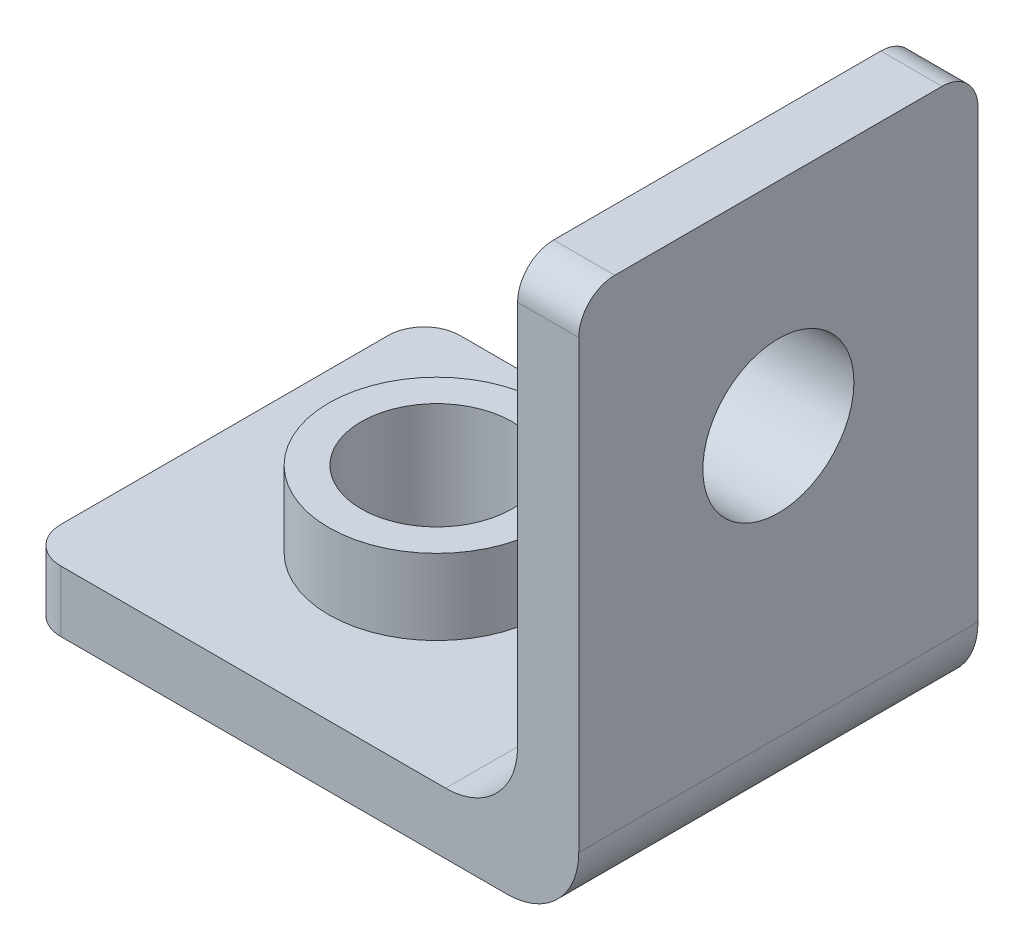
ISO-10303-21;
HEADER;
FILE_DESCRIPTION(('STEP AP214'),'2;1');
FILE_NAME('part.step','',(''),(''),'','','');
FILE_SCHEMA(('AUTOMOTIVE_DESIGN { 1 0 10303 214 1 1 1 1 }'));
ENDSEC;
DATA;
#1=APPLICATION_CONTEXT('core data for automotive mechanical design processes');
#2=APPLICATION_PROTOCOL_DEFINITION('international standard','automotive_design',2000,#1);
#3=PRODUCT_CONTEXT('',#1,'mechanical');
#4=PRODUCT('Part','Part','',(#3));
#5=PRODUCT_RELATED_PRODUCT_CATEGORY('part','',(#4));
#6=PRODUCT_DEFINITION_FORMATION('','',#4);
#7=PRODUCT_DEFINITION_CONTEXT('part definition',#1,'design');
#8=PRODUCT_DEFINITION('design','',#6,#7);
#9=PRODUCT_DEFINITION_SHAPE('','',#8);
#10=(LENGTH_UNIT() NAMED_UNIT(*) SI_UNIT(.MILLI.,.METRE.));
#11=(NAMED_UNIT(*) PLANE_ANGLE_UNIT() SI_UNIT($,.RADIAN.));
#12=(NAMED_UNIT(*) SI_UNIT($,.STERADIAN.) SOLID_ANGLE_UNIT());
#13=UNCERTAINTY_MEASURE_WITH_UNIT(LENGTH_MEASURE(1.E-05),#10,'distance_accuracy_value','');
#14=(GEOMETRIC_REPRESENTATION_CONTEXT(3) GLOBAL_UNCERTAINTY_ASSIGNED_CONTEXT((#13)) GLOBAL_UNIT_ASSIGNED_CONTEXT((#10,
#11,#12)) REPRESENTATION_CONTEXT('',''));
#15=CARTESIAN_POINT('',(0.,0.,0.));
#16=DIRECTION('',(0.,0.,1.));
#17=DIRECTION('',(1.,0.,0.));
#18=AXIS2_PLACEMENT_3D('',#15,#16,#17);
#19=CARTESIAN_POINT('',(-15.4,0.,11.1));
#20=DIRECTION('',(0.,1.,0.));
#21=DIRECTION('',(0.,0.,1.));
#22=AXIS2_PLACEMENT_3D('',#19,#20,#21);
#23=PLANE('',#22);
#24=CARTESIAN_POINT('',(-9.5,0.,5.55));
#25=DIRECTION('',(0.,-1.,0.));
#26=DIRECTION('',(0.,0.,-1.));
#27=AXIS2_PLACEMENT_3D('',#24,#25,#26);
#28=CIRCLE('',#27,2.09999999999999);
#29=CARTESIAN_POINT('',(-9.5,0.,3.45000000000001));
#30=VERTEX_POINT('',#29);
#31=EDGE_CURVE('E508',#30,#30,#28,.T.);
#32=ORIENTED_EDGE('',*,*,#31,.F.);
#33=EDGE_LOOP('',(#32));
#34=FACE_BOUND('',#33,.T.);
#35=DIRECTION('',(1.,0.,0.));
#36=VECTOR('',#35,1.);
#37=CARTESIAN_POINT('',(-15.4,0.,0.));
#38=LINE('',#37,#36);
#39=CARTESIAN_POINT('',(-14.4,0.,0.));
#40=VERTEX_POINT('',#39);
#41=CARTESIAN_POINT('',(-2.,0.,0.));
#42=VERTEX_POINT('',#41);
#43=EDGE_CURVE('E165',#40,#42,#38,.T.);
#44=ORIENTED_EDGE('',*,*,#43,.T.);
#45=DIRECTION('',(0.,0.,-1.));
#46=VECTOR('',#45,1.);
#47=CARTESIAN_POINT('',(-2.,0.,11.1));
#48=LINE('',#47,#46);
#49=CARTESIAN_POINT('',(-2.,0.,11.1));
#50=VERTEX_POINT('',#49);
#51=EDGE_CURVE('E55',#42,#50,#48,.F.);
#52=ORIENTED_EDGE('',*,*,#51,.T.);
#53=DIRECTION('',(1.,0.,0.));
#54=VECTOR('',#53,1.);
#55=CARTESIAN_POINT('',(-15.4,0.,11.1));
#56=LINE('',#55,#54);
#57=CARTESIAN_POINT('',(-14.4,0.,11.1));
#58=VERTEX_POINT('',#57);
#59=EDGE_CURVE('E143',#58,#50,#56,.T.);
#60=ORIENTED_EDGE('',*,*,#59,.F.);
#61=CARTESIAN_POINT('',(-14.4,0.,10.1));
#62=DIRECTION('',(0.,1.,0.));
#63=DIRECTION('',(0.,0.,1.));
#64=AXIS2_PLACEMENT_3D('',#61,#62,#63);
#65=CIRCLE('',#64,1.);
#66=CARTESIAN_POINT('',(-15.4,0.,10.1));
#67=VERTEX_POINT('',#66);
#68=EDGE_CURVE('E130',#58,#67,#65,.F.);
#69=ORIENTED_EDGE('',*,*,#68,.T.);
#70=DIRECTION('',(0.,0.,-1.));
#71=VECTOR('',#70,1.);
#72=CARTESIAN_POINT('',(-15.4,0.,11.1));
#73=LINE('',#72,#71);
#74=CARTESIAN_POINT('',(-15.4,0.,0.999999999999999));
#75=VERTEX_POINT('',#74);
#76=EDGE_CURVE('E164',#67,#75,#73,.T.);
#77=ORIENTED_EDGE('',*,*,#76,.T.);
#78=CARTESIAN_POINT('',(-14.4,0.,0.999999999999999));
#79=DIRECTION('',(0.,1.,0.));
#80=DIRECTION('',(0.,0.,1.));
#81=AXIS2_PLACEMENT_3D('',#78,#79,#80);
#82=CIRCLE('',#81,1.);
#83=EDGE_CURVE('E139',#75,#40,#82,.F.);
#84=ORIENTED_EDGE('',*,*,#83,.T.);
#85=EDGE_LOOP('',(#44,#52,#60,#69,#77,#84));
#86=FACE_BOUND('',#85,.T.);
#87=ADVANCED_FACE('F40',(#34,#86),#23,.F.);
#88=CARTESIAN_POINT('',(0.,0.,11.1));
#89=DIRECTION('',(-1.,0.,0.));
#90=DIRECTION('',(0.,0.,1.));
#91=AXIS2_PLACEMENT_3D('',#88,#89,#90);
#92=PLANE('',#91);
#93=CARTESIAN_POINT('',(0.,9.5,5.55));
#94=DIRECTION('',(1.,0.,0.));
#95=DIRECTION('',(0.,0.,-1.));
#96=AXIS2_PLACEMENT_3D('',#93,#94,#95);
#97=CIRCLE('',#96,2.09999999999999);
#98=CARTESIAN_POINT('',(0.,9.5,3.45000000000001));
#99=VERTEX_POINT('',#98);
#100=EDGE_CURVE('E500',#99,#99,#97,.T.);
#101=ORIENTED_EDGE('',*,*,#100,.F.);
#102=EDGE_LOOP('',(#101));
#103=FACE_BOUND('',#102,.T.);
#104=DIRECTION('',(0.,1.,0.));
#105=VECTOR('',#104,1.);
#106=CARTESIAN_POINT('',(0.,0.,11.1));
#107=LINE('',#106,#105);
#108=CARTESIAN_POINT('',(0.,2.,11.1));
#109=VERTEX_POINT('',#108);
#110=CARTESIAN_POINT('',(0.,14.4,11.1));
#111=VERTEX_POINT('',#110);
#112=EDGE_CURVE('E150',#109,#111,#107,.T.);
#113=ORIENTED_EDGE('',*,*,#112,.F.);
#114=DIRECTION('',(0.,0.,-1.));
#115=VECTOR('',#114,1.);
#116=CARTESIAN_POINT('',(0.,2.,11.1));
#117=LINE('',#116,#115);
#118=CARTESIAN_POINT('',(0.,2.,0.));
#119=VERTEX_POINT('',#118);
#120=EDGE_CURVE('E223',#109,#119,#117,.T.);
#121=ORIENTED_EDGE('',*,*,#120,.T.);
#122=DIRECTION('',(0.,1.,0.));
#123=VECTOR('',#122,1.);
#124=CARTESIAN_POINT('',(0.,0.,0.));
#125=LINE('',#124,#123);
#126=CARTESIAN_POINT('',(0.,14.4,0.));
#127=VERTEX_POINT('',#126);
#128=EDGE_CURVE('E167',#119,#127,#125,.T.);
#129=ORIENTED_EDGE('',*,*,#128,.T.);
#130=CARTESIAN_POINT('',(0.,14.4,0.999999999999999));
#131=DIRECTION('',(-1.,0.,0.));
#132=DIRECTION('',(0.,0.,1.));
#133=AXIS2_PLACEMENT_3D('',#130,#131,#132);
#134=CIRCLE('',#133,1.);
#135=CARTESIAN_POINT('',(0.,15.4,0.999999999999999));
#136=VERTEX_POINT('',#135);
#137=EDGE_CURVE('E209',#127,#136,#134,.F.);
#138=ORIENTED_EDGE('',*,*,#137,.T.);
#139=DIRECTION('',(0.,0.,-1.));
#140=VECTOR('',#139,1.);
#141=CARTESIAN_POINT('',(0.,15.4,11.1));
#142=LINE('',#141,#140);
#143=CARTESIAN_POINT('',(0.,15.4,10.1));
#144=VERTEX_POINT('',#143);
#145=EDGE_CURVE('E178',#144,#136,#142,.T.);
#146=ORIENTED_EDGE('',*,*,#145,.F.);
#147=CARTESIAN_POINT('',(0.,14.4,10.1));
#148=DIRECTION('',(-1.,0.,0.));
#149=DIRECTION('',(0.,0.,1.));
#150=AXIS2_PLACEMENT_3D('',#147,#148,#149);
#151=CIRCLE('',#150,1.);
#152=EDGE_CURVE('E206',#144,#111,#151,.F.);
#153=ORIENTED_EDGE('',*,*,#152,.T.);
#154=EDGE_LOOP('',(#113,#121,#129,#138,#146,#153));
#155=FACE_BOUND('',#154,.T.);
#156=ADVANCED_FACE('F255',(#103,#155),#92,.F.);
#157=CARTESIAN_POINT('',(0.,15.4,11.1));
#158=DIRECTION('',(0.,-1.,0.));
#159=DIRECTION('',(0.,0.,-1.));
#160=AXIS2_PLACEMENT_3D('',#157,#158,#159);
#161=PLANE('',#160);
#162=ORIENTED_EDGE('',*,*,#145,.T.);
#163=DIRECTION('',(-1.,0.,0.));
#164=VECTOR('',#163,1.);
#165=CARTESIAN_POINT('',(0.,15.4,0.999999999999999));
#166=LINE('',#165,#164);
#167=CARTESIAN_POINT('',(-1.7,15.4,0.999999999999999));
#168=VERTEX_POINT('',#167);
#169=EDGE_CURVE('E199',#136,#168,#166,.T.);
#170=ORIENTED_EDGE('',*,*,#169,.T.);
#171=DIRECTION('',(0.,0.,-1.));
#172=VECTOR('',#171,1.);
#173=CARTESIAN_POINT('',(-1.7,15.4,11.1));
#174=LINE('',#173,#172);
#175=CARTESIAN_POINT('',(-1.7,15.4,10.1));
#176=VERTEX_POINT('',#175);
#177=EDGE_CURVE('E175',#176,#168,#174,.T.);
#178=ORIENTED_EDGE('',*,*,#177,.F.);
#179=DIRECTION('',(-1.,0.,0.));
#180=VECTOR('',#179,1.);
#181=CARTESIAN_POINT('',(0.,15.4,10.1));
#182=LINE('',#181,#180);
#183=EDGE_CURVE('E197',#176,#144,#182,.F.);
#184=ORIENTED_EDGE('',*,*,#183,.T.);
#185=EDGE_LOOP('',(#162,#170,#178,#184));
#186=FACE_BOUND('',#185,.T.);
#187=ADVANCED_FACE('F264',(#186),#161,.F.);
#188=CARTESIAN_POINT('',(-1.7,15.4,11.1));
#189=DIRECTION('',(1.,0.,0.));
#190=DIRECTION('',(0.,1.,0.));
#191=AXIS2_PLACEMENT_3D('',#188,#189,#190);
#192=PLANE('',#191);
#193=CARTESIAN_POINT('',(-1.7,9.5,5.55));
#194=DIRECTION('',(1.,0.,0.));
#195=DIRECTION('',(0.,1.,0.));
#196=AXIS2_PLACEMENT_3D('',#193,#194,#195);
#197=CIRCLE('',#196,3.);
#198=CARTESIAN_POINT('',(-1.7,9.5,2.55));
#199=VERTEX_POINT('',#198);
#200=EDGE_CURVE('E215',#199,#199,#197,.T.);
#201=ORIENTED_EDGE('',*,*,#200,.T.);
#202=EDGE_LOOP('',(#201));
#203=FACE_BOUND('',#202,.T.);
#204=DIRECTION('',(0.,-1.,0.));
#205=VECTOR('',#204,1.);
#206=CARTESIAN_POINT('',(-1.7,15.4,0.));
#207=LINE('',#206,#205);
#208=CARTESIAN_POINT('',(-1.7,14.4,0.));
#209=VERTEX_POINT('',#208);
#210=CARTESIAN_POINT('',(-1.7,3.7,0.));
#211=VERTEX_POINT('',#210);
#212=EDGE_CURVE('E155',#209,#211,#207,.T.);
#213=ORIENTED_EDGE('',*,*,#212,.T.);
#214=DIRECTION('',(0.,0.,-1.));
#215=VECTOR('',#214,1.);
#216=CARTESIAN_POINT('',(-1.7,3.7,11.1));
#217=LINE('',#216,#215);
#218=CARTESIAN_POINT('',(-1.7,3.7,11.1));
#219=VERTEX_POINT('',#218);
#220=EDGE_CURVE('E221',#211,#219,#217,.F.);
#221=ORIENTED_EDGE('',*,*,#220,.T.);
#222=DIRECTION('',(0.,-1.,0.));
#223=VECTOR('',#222,1.);
#224=CARTESIAN_POINT('',(-1.7,15.4,11.1));
#225=LINE('',#224,#223);
#226=CARTESIAN_POINT('',(-1.7,14.4,11.1));
#227=VERTEX_POINT('',#226);
#228=EDGE_CURVE('E153',#227,#219,#225,.T.);
#229=ORIENTED_EDGE('',*,*,#228,.F.);
#230=CARTESIAN_POINT('',(-1.7,14.4,10.1));
#231=DIRECTION('',(1.,0.,0.));
#232=DIRECTION('',(0.,1.,0.));
#233=AXIS2_PLACEMENT_3D('',#230,#231,#232);
#234=CIRCLE('',#233,1.);
#235=EDGE_CURVE('E202',#227,#176,#234,.F.);
#236=ORIENTED_EDGE('',*,*,#235,.T.);
#237=ORIENTED_EDGE('',*,*,#177,.T.);
#238=CARTESIAN_POINT('',(-1.7,14.4,0.999999999999999));
#239=DIRECTION('',(1.,0.,0.));
#240=DIRECTION('',(0.,1.,0.));
#241=AXIS2_PLACEMENT_3D('',#238,#239,#240);
#242=CIRCLE('',#241,1.);
#243=EDGE_CURVE('E204',#168,#209,#242,.F.);
#244=ORIENTED_EDGE('',*,*,#243,.T.);
#245=EDGE_LOOP('',(#213,#221,#229,#236,#237,#244));
#246=FACE_BOUND('',#245,.T.);
#247=ADVANCED_FACE('F237',(#203,#246),#192,.F.);
#248=CARTESIAN_POINT('',(-1.69999999999999,1.7,11.1));
#249=DIRECTION('',(0.,-1.,0.));
#250=DIRECTION('',(0.,0.,-1.));
#251=AXIS2_PLACEMENT_3D('',#248,#249,#250);
#252=PLANE('',#251);
#253=CARTESIAN_POINT('',(-9.5,1.7,5.55));
#254=DIRECTION('',(0.,-1.,0.));
#255=DIRECTION('',(0.,0.,-1.));
#256=AXIS2_PLACEMENT_3D('',#253,#254,#255);
#257=CIRCLE('',#256,3.);
#258=CARTESIAN_POINT('',(-9.5,1.7,2.55));
#259=VERTEX_POINT('',#258);
#260=EDGE_CURVE('E211',#259,#259,#257,.F.);
#261=ORIENTED_EDGE('',*,*,#260,.F.);
#262=EDGE_LOOP('',(#261));
#263=FACE_BOUND('',#262,.T.);
#264=DIRECTION('',(-1.,0.,0.));
#265=VECTOR('',#264,1.);
#266=CARTESIAN_POINT('',(-1.69999999999999,1.7,11.1));
#267=LINE('',#266,#265);
#268=CARTESIAN_POINT('',(-3.7,1.7,11.1));
#269=VERTEX_POINT('',#268);
#270=CARTESIAN_POINT('',(-14.4,1.7,11.1));
#271=VERTEX_POINT('',#270);
#272=EDGE_CURVE('E146',#269,#271,#267,.T.);
#273=ORIENTED_EDGE('',*,*,#272,.F.);
#274=DIRECTION('',(0.,0.,-1.));
#275=VECTOR('',#274,1.);
#276=CARTESIAN_POINT('',(-3.7,1.7,0.));
#277=LINE('',#276,#275);
#278=CARTESIAN_POINT('',(-3.7,1.7,0.));
#279=VERTEX_POINT('',#278);
#280=EDGE_CURVE('E214',#269,#279,#277,.T.);
#281=ORIENTED_EDGE('',*,*,#280,.T.);
#282=DIRECTION('',(-1.,0.,0.));
#283=VECTOR('',#282,1.);
#284=CARTESIAN_POINT('',(-1.69999999999999,1.7,0.));
#285=LINE('',#284,#283);
#286=CARTESIAN_POINT('',(-14.4,1.7,0.));
#287=VERTEX_POINT('',#286);
#288=EDGE_CURVE('E151',#279,#287,#285,.T.);
#289=ORIENTED_EDGE('',*,*,#288,.T.);
#290=CARTESIAN_POINT('',(-14.4,1.7,0.999999999999999));
#291=DIRECTION('',(0.,-1.,0.));
#292=DIRECTION('',(0.,0.,-1.));
#293=AXIS2_PLACEMENT_3D('',#290,#291,#292);
#294=CIRCLE('',#293,1.);
#295=CARTESIAN_POINT('',(-15.4,1.7,0.999999999999999));
#296=VERTEX_POINT('',#295);
#297=EDGE_CURVE('E187',#287,#296,#294,.F.);
#298=ORIENTED_EDGE('',*,*,#297,.T.);
#299=DIRECTION('',(0.,0.,-1.));
#300=VECTOR('',#299,1.);
#301=CARTESIAN_POINT('',(-15.4,1.7,11.1));
#302=LINE('',#301,#300);
#303=CARTESIAN_POINT('',(-15.4,1.7,10.1));
#304=VERTEX_POINT('',#303);
#305=EDGE_CURVE('E172',#304,#296,#302,.T.);
#306=ORIENTED_EDGE('',*,*,#305,.F.);
#307=CARTESIAN_POINT('',(-14.4,1.7,10.1));
#308=DIRECTION('',(0.,-1.,0.));
#309=DIRECTION('',(0.,0.,-1.));
#310=AXIS2_PLACEMENT_3D('',#307,#308,#309);
#311=CIRCLE('',#310,1.);
#312=EDGE_CURVE('E189',#304,#271,#311,.F.);
#313=ORIENTED_EDGE('',*,*,#312,.T.);
#314=EDGE_LOOP('',(#273,#281,#289,#298,#306,#313));
#315=FACE_BOUND('',#314,.T.);
#316=ADVANCED_FACE('F242',(#263,#315),#252,.F.);
#317=CARTESIAN_POINT('',(-15.4,1.7,11.1));
#318=DIRECTION('',(1.,0.,0.));
#319=DIRECTION('',(0.,0.,-1.));
#320=AXIS2_PLACEMENT_3D('',#317,#318,#319);
#321=PLANE('',#320);
#322=ORIENTED_EDGE('',*,*,#76,.F.);
#323=DIRECTION('',(0.,-1.,0.));
#324=VECTOR('',#323,1.);
#325=CARTESIAN_POINT('',(-15.4,1.7,10.1));
#326=LINE('',#325,#324);
#327=EDGE_CURVE('E135',#67,#304,#326,.F.);
#328=ORIENTED_EDGE('',*,*,#327,.T.);
#329=ORIENTED_EDGE('',*,*,#305,.T.);
#330=DIRECTION('',(0.,-1.,0.));
#331=VECTOR('',#330,1.);
#332=CARTESIAN_POINT('',(-15.4,1.7,0.999999999999999));
#333=LINE('',#332,#331);
#334=EDGE_CURVE('E138',#296,#75,#333,.T.);
#335=ORIENTED_EDGE('',*,*,#334,.T.);
#336=EDGE_LOOP('',(#322,#328,#329,#335));
#337=FACE_BOUND('',#336,.T.);
#338=ADVANCED_FACE('F247',(#337),#321,.F.);
#339=CARTESIAN_POINT('',(0.,0.,11.1));
#340=DIRECTION('',(0.,0.,1.));
#341=DIRECTION('',(1.,0.,0.));
#342=AXIS2_PLACEMENT_3D('',#339,#340,#341);
#343=PLANE('',#342);
#344=ORIENTED_EDGE('',*,*,#59,.T.);
#345=CARTESIAN_POINT('',(-2.,2.,11.1));
#346=DIRECTION('',(0.,0.,1.));
#347=DIRECTION('',(1.,0.,0.));
#348=AXIS2_PLACEMENT_3D('',#345,#346,#347);
#349=CIRCLE('',#348,2.);
#350=EDGE_CURVE('E228',#50,#109,#349,.T.);
#351=ORIENTED_EDGE('',*,*,#350,.T.);
#352=ORIENTED_EDGE('',*,*,#112,.T.);
#353=DIRECTION('',(-1.,0.,0.));
#354=VECTOR('',#353,1.);
#355=CARTESIAN_POINT('',(-1.7,14.4,11.1));
#356=LINE('',#355,#354);
#357=EDGE_CURVE('E148',#111,#227,#356,.T.);
#358=ORIENTED_EDGE('',*,*,#357,.T.);
#359=ORIENTED_EDGE('',*,*,#228,.T.);
#360=CARTESIAN_POINT('',(-3.7,3.7,11.1));
#361=DIRECTION('',(0.,0.,1.));
#362=DIRECTION('',(1.,0.,0.));
#363=AXIS2_PLACEMENT_3D('',#360,#361,#362);
#364=CIRCLE('',#363,2.);
#365=EDGE_CURVE('E11',#219,#269,#364,.F.);
#366=ORIENTED_EDGE('',*,*,#365,.T.);
#367=ORIENTED_EDGE('',*,*,#272,.T.);
#368=DIRECTION('',(0.,-1.,0.));
#369=VECTOR('',#368,1.);
#370=CARTESIAN_POINT('',(-14.4,0.,11.1));
#371=LINE('',#370,#369);
#372=EDGE_CURVE('E134',#271,#58,#371,.T.);
#373=ORIENTED_EDGE('',*,*,#372,.T.);
#374=EDGE_LOOP('',(#344,#351,#352,#358,#359,#366,#367,#373));
#375=FACE_BOUND('',#374,.T.);
#376=ADVANCED_FACE('F142',(#375),#343,.T.);
#377=CARTESIAN_POINT('',(0.,0.,0.));
#378=DIRECTION('',(0.,0.,1.));
#379=DIRECTION('',(1.,0.,0.));
#380=AXIS2_PLACEMENT_3D('',#377,#378,#379);
#381=PLANE('',#380);
#382=ORIENTED_EDGE('',*,*,#128,.F.);
#383=CARTESIAN_POINT('',(-2.,2.,0.));
#384=DIRECTION('',(0.,0.,1.));
#385=DIRECTION('',(1.,0.,0.));
#386=AXIS2_PLACEMENT_3D('',#383,#384,#385);
#387=CIRCLE('',#386,2.);
#388=EDGE_CURVE('E63',#119,#42,#387,.F.);
#389=ORIENTED_EDGE('',*,*,#388,.T.);
#390=ORIENTED_EDGE('',*,*,#43,.F.);
#391=DIRECTION('',(0.,-1.,0.));
#392=VECTOR('',#391,1.);
#393=CARTESIAN_POINT('',(-14.4,0.,0.));
#394=LINE('',#393,#392);
#395=EDGE_CURVE('E194',#40,#287,#394,.F.);
#396=ORIENTED_EDGE('',*,*,#395,.T.);
#397=ORIENTED_EDGE('',*,*,#288,.F.);
#398=CARTESIAN_POINT('',(-3.7,3.7,0.));
#399=DIRECTION('',(0.,0.,1.));
#400=DIRECTION('',(1.,0.,0.));
#401=AXIS2_PLACEMENT_3D('',#398,#399,#400);
#402=CIRCLE('',#401,2.);
#403=EDGE_CURVE('E48',#279,#211,#402,.T.);
#404=ORIENTED_EDGE('',*,*,#403,.T.);
#405=ORIENTED_EDGE('',*,*,#212,.F.);
#406=DIRECTION('',(-1.,0.,0.));
#407=VECTOR('',#406,1.);
#408=CARTESIAN_POINT('',(0.,14.4,0.));
#409=LINE('',#408,#407);
#410=EDGE_CURVE('E191',#209,#127,#409,.F.);
#411=ORIENTED_EDGE('',*,*,#410,.T.);
#412=EDGE_LOOP('',(#382,#389,#390,#396,#397,#404,#405,#411));
#413=FACE_BOUND('',#412,.T.);
#414=ADVANCED_FACE('F231',(#413),#381,.F.);
#415=CARTESIAN_POINT('',(-14.4,0.,10.1));
#416=DIRECTION('',(0.,1.,0.));
#417=DIRECTION('',(0.,0.,1.));
#418=AXIS2_PLACEMENT_3D('',#415,#416,#417);
#419=CYLINDRICAL_SURFACE('',#418,1.);
#420=ORIENTED_EDGE('',*,*,#312,.F.);
#421=ORIENTED_EDGE('',*,*,#327,.F.);
#422=ORIENTED_EDGE('',*,*,#68,.F.);
#423=ORIENTED_EDGE('',*,*,#372,.F.);
#424=EDGE_LOOP('',(#420,#421,#422,#423));
#425=FACE_BOUND('',#424,.T.);
#426=ADVANCED_FACE('F133',(#425),#419,.T.);
#427=CARTESIAN_POINT('',(-14.4,1.7,0.999999999999999));
#428=DIRECTION('',(0.,-1.,0.));
#429=DIRECTION('',(0.,0.,-1.));
#430=AXIS2_PLACEMENT_3D('',#427,#428,#429);
#431=CYLINDRICAL_SURFACE('',#430,1.);
#432=ORIENTED_EDGE('',*,*,#297,.F.);
#433=ORIENTED_EDGE('',*,*,#395,.F.);
#434=ORIENTED_EDGE('',*,*,#83,.F.);
#435=ORIENTED_EDGE('',*,*,#334,.F.);
#436=EDGE_LOOP('',(#432,#433,#434,#435));
#437=FACE_BOUND('',#436,.T.);
#438=ADVANCED_FACE('F249',(#437),#431,.T.);
#439=CARTESIAN_POINT('',(0.,14.4,0.999999999999999));
#440=DIRECTION('',(-1.,0.,0.));
#441=DIRECTION('',(0.,0.,1.));
#442=AXIS2_PLACEMENT_3D('',#439,#440,#441);
#443=CYLINDRICAL_SURFACE('',#442,1.);
#444=ORIENTED_EDGE('',*,*,#137,.F.);
#445=ORIENTED_EDGE('',*,*,#410,.F.);
#446=ORIENTED_EDGE('',*,*,#243,.F.);
#447=ORIENTED_EDGE('',*,*,#169,.F.);
#448=EDGE_LOOP('',(#444,#445,#446,#447));
#449=FACE_BOUND('',#448,.T.);
#450=ADVANCED_FACE('F268',(#449),#443,.T.);
#451=CARTESIAN_POINT('',(0.,14.4,10.1));
#452=DIRECTION('',(1.,0.,0.));
#453=DIRECTION('',(0.,0.,-1.));
#454=AXIS2_PLACEMENT_3D('',#451,#452,#453);
#455=CYLINDRICAL_SURFACE('',#454,1.);
#456=ORIENTED_EDGE('',*,*,#152,.F.);
#457=ORIENTED_EDGE('',*,*,#183,.F.);
#458=ORIENTED_EDGE('',*,*,#235,.F.);
#459=ORIENTED_EDGE('',*,*,#357,.F.);
#460=EDGE_LOOP('',(#456,#457,#458,#459));
#461=FACE_BOUND('',#460,.T.);
#462=ADVANCED_FACE('F261',(#461),#455,.T.);
#463=CARTESIAN_POINT('',(-9.5,3.8,5.55));
#464=DIRECTION('',(0.,-1.,0.));
#465=DIRECTION('',(0.,0.,-1.));
#466=AXIS2_PLACEMENT_3D('',#463,#464,#465);
#467=CYLINDRICAL_SURFACE('',#466,3.);
#468=CARTESIAN_POINT('',(-9.5,3.8,5.55));
#469=DIRECTION('',(0.,1.,0.));
#470=DIRECTION('',(0.,0.,1.));
#471=AXIS2_PLACEMENT_3D('',#468,#469,#470);
#472=CIRCLE('',#471,3.);
#473=CARTESIAN_POINT('',(-9.5,3.8,2.55));
#474=VERTEX_POINT('',#473);
#475=EDGE_CURVE('E158',#474,#474,#472,.T.);
#476=CARTESIAN_POINT('',(-9.5,3.8,2.55));
#477=CARTESIAN_POINT('',(-9.5,3.778125,2.55));
#478=CARTESIAN_POINT('',(-9.5,3.75625,2.55));
#479=CARTESIAN_POINT('',(-9.5,3.7125,2.55));
#480=CARTESIAN_POINT('',(-9.5,3.690625,2.55));
#481=CARTESIAN_POINT('',(-9.5,3.646875,2.55));
#482=CARTESIAN_POINT('',(-9.5,3.625,2.55));
#483=CARTESIAN_POINT('',(-9.5,3.58125,2.55));
#484=CARTESIAN_POINT('',(-9.5,3.559375,2.55));
#485=CARTESIAN_POINT('',(-9.5,3.515625,2.55));
#486=CARTESIAN_POINT('',(-9.5,3.49375,2.55));
#487=CARTESIAN_POINT('',(-9.5,3.45,2.55));
#488=CARTESIAN_POINT('',(-9.5,3.428125,2.55));
#489=CARTESIAN_POINT('',(-9.5,3.384375,2.55));
#490=CARTESIAN_POINT('',(-9.5,3.3625,2.55));
#491=CARTESIAN_POINT('',(-9.5,3.31875,2.55));
#492=CARTESIAN_POINT('',(-9.5,3.296875,2.55));
#493=CARTESIAN_POINT('',(-9.5,3.253125,2.55));
#494=CARTESIAN_POINT('',(-9.5,3.23125,2.55));
#495=CARTESIAN_POINT('',(-9.5,3.1875,2.55));
#496=CARTESIAN_POINT('',(-9.5,3.165625,2.55));
#497=CARTESIAN_POINT('',(-9.5,3.121875,2.55));
#498=CARTESIAN_POINT('',(-9.5,3.1,2.55));
#499=CARTESIAN_POINT('',(-9.5,3.05625,2.55));
#500=CARTESIAN_POINT('',(-9.5,3.034375,2.55));
#501=CARTESIAN_POINT('',(-9.5,2.990625,2.55));
#502=CARTESIAN_POINT('',(-9.5,2.96875,2.55));
#503=CARTESIAN_POINT('',(-9.5,2.925,2.55));
#504=CARTESIAN_POINT('',(-9.5,2.903125,2.55));
#505=CARTESIAN_POINT('',(-9.5,2.859375,2.55));
#506=CARTESIAN_POINT('',(-9.5,2.8375,2.55));
#507=CARTESIAN_POINT('',(-9.5,2.79375,2.55));
#508=CARTESIAN_POINT('',(-9.5,2.771875,2.55));
#509=CARTESIAN_POINT('',(-9.5,2.728125,2.55));
#510=CARTESIAN_POINT('',(-9.5,2.70625,2.55));
#511=CARTESIAN_POINT('',(-9.5,2.6625,2.55));
#512=CARTESIAN_POINT('',(-9.5,2.640625,2.55));
#513=CARTESIAN_POINT('',(-9.5,2.596875,2.55));
#514=CARTESIAN_POINT('',(-9.5,2.575,2.55));
#515=CARTESIAN_POINT('',(-9.5,2.53125,2.55));
#516=CARTESIAN_POINT('',(-9.5,2.509375,2.55));
#517=CARTESIAN_POINT('',(-9.5,2.465625,2.55));
#518=CARTESIAN_POINT('',(-9.5,2.44375,2.55));
#519=CARTESIAN_POINT('',(-9.5,2.4,2.55));
#520=CARTESIAN_POINT('',(-9.5,2.378125,2.55));
#521=CARTESIAN_POINT('',(-9.5,2.334375,2.55));
#522=CARTESIAN_POINT('',(-9.5,2.3125,2.55));
#523=CARTESIAN_POINT('',(-9.5,2.26875,2.55));
#524=CARTESIAN_POINT('',(-9.5,2.246875,2.55));
#525=CARTESIAN_POINT('',(-9.5,2.203125,2.55));
#526=CARTESIAN_POINT('',(-9.5,2.18125,2.55));
#527=CARTESIAN_POINT('',(-9.5,2.1375,2.55));
#528=CARTESIAN_POINT('',(-9.5,2.115625,2.55));
#529=CARTESIAN_POINT('',(-9.5,2.071875,2.55));
#530=CARTESIAN_POINT('',(-9.5,2.05,2.55));
#531=CARTESIAN_POINT('',(-9.5,2.00625,2.55));
#532=CARTESIAN_POINT('',(-9.5,1.984375,2.55));
#533=CARTESIAN_POINT('',(-9.5,1.940625,2.55));
#534=CARTESIAN_POINT('',(-9.5,1.91875,2.55));
#535=CARTESIAN_POINT('',(-9.5,1.875,2.55));
#536=CARTESIAN_POINT('',(-9.5,1.853125,2.55));
#537=CARTESIAN_POINT('',(-9.5,1.809375,2.55));
#538=CARTESIAN_POINT('',(-9.5,1.7875,2.55));
#539=CARTESIAN_POINT('',(-9.5,1.74375,2.55));
#540=CARTESIAN_POINT('',(-9.5,1.721875,2.55));
#541=CARTESIAN_POINT('',(-9.5,1.7,2.55));
#542=B_SPLINE_CURVE_WITH_KNOTS('',3,(#476,#477,#478,#479,#480,#481,#482,#483,#484,#485,#486,
#487,#488,#489,#490,#491,#492,#493,#494,#495,#496,#497,#498,#499,#500,#501,#502,#503,#504,#505,
#506,#507,#508,#509,#510,#511,#512,#513,#514,#515,#516,#517,#518,#519,#520,#521,#522,#523,#524,
#525,#526,#527,#528,#529,#530,#531,#532,#533,#534,#535,#536,#537,#538,#539,#540,#541),
.UNSPECIFIED.,.F.,.F.,(4,2,2,2,2,2,2,2,2,2,2,2,2,2,2,2,2,2,2,2,2,2,2,2,2,2,2,2,2,2,2,2,4),(0.,
0.0656249999999997,0.13125,0.196875,0.2625,0.328125,0.39375,0.459375,0.524999999999999,0.590625,
0.65625,0.721874999999999,0.7875,0.853125,0.918749999999999,0.984375,1.05,1.115625,1.18125,
1.246875,1.3125,1.378125,1.44375,1.509375,1.575,1.640625,1.70625,1.771875,1.8375,1.903125,
1.96875,2.034375,2.1),.UNSPECIFIED.);
#543=EDGE_CURVE('BSEAM275',#474,#259,#542,.T.);
#544=ORIENTED_EDGE('',*,*,#475,.F.);
#545=ORIENTED_EDGE('',*,*,#260,.T.);
#546=ORIENTED_EDGE('',*,*,#543,.T.);
#547=ORIENTED_EDGE('',*,*,#543,.F.);
#548=EDGE_LOOP('',(#544,#546,#545,#547));
#549=FACE_BOUND('',#548,.T.);
#550=ADVANCED_FACE('F275',(#549),#467,.T.);
#551=CARTESIAN_POINT('',(-9.5,3.8,5.55));
#552=DIRECTION('',(0.,1.,0.));
#553=DIRECTION('',(0.,0.,1.));
#554=AXIS2_PLACEMENT_3D('',#551,#552,#553);
#555=PLANE('',#554);
#556=CARTESIAN_POINT('',(-9.5,3.8,5.55));
#557=DIRECTION('',(0.,1.,0.));
#558=DIRECTION('',(0.,0.,1.));
#559=AXIS2_PLACEMENT_3D('',#556,#557,#558);
#560=CIRCLE('',#559,2.09999999999999);
#561=CARTESIAN_POINT('',(-9.5,3.8,7.64999999999999));
#562=VERTEX_POINT('',#561);
#563=EDGE_CURVE('E505',#562,#562,#560,.T.);
#564=ORIENTED_EDGE('',*,*,#563,.F.);
#565=EDGE_LOOP('',(#564));
#566=FACE_BOUND('',#565,.T.);
#567=ORIENTED_EDGE('',*,*,#475,.T.);
#568=EDGE_LOOP('',(#567));
#569=FACE_BOUND('',#568,.T.);
#570=ADVANCED_FACE('F396',(#566,#569),#555,.T.);
#571=CARTESIAN_POINT('',(-3.8,9.5,5.55));
#572=DIRECTION('',(1.,0.,0.));
#573=DIRECTION('',(0.,0.,-1.));
#574=AXIS2_PLACEMENT_3D('',#571,#572,#573);
#575=CYLINDRICAL_SURFACE('',#574,3.);
#576=CARTESIAN_POINT('',(-3.8,9.5,5.55));
#577=DIRECTION('',(1.,0.,0.));
#578=DIRECTION('',(0.,0.,-1.));
#579=AXIS2_PLACEMENT_3D('',#576,#577,#578);
#580=CIRCLE('',#579,3.);
#581=CARTESIAN_POINT('',(-3.8,9.5,2.55));
#582=VERTEX_POINT('',#581);
#583=EDGE_CURVE('E218',#582,#582,#580,.T.);
#584=CARTESIAN_POINT('',(-3.8,9.5,2.55));
#585=CARTESIAN_POINT('',(-3.778125,9.5,2.55));
#586=CARTESIAN_POINT('',(-3.75625,9.5,2.55));
#587=CARTESIAN_POINT('',(-3.7125,9.5,2.55));
#588=CARTESIAN_POINT('',(-3.690625,9.5,2.55));
#589=CARTESIAN_POINT('',(-3.646875,9.5,2.55));
#590=CARTESIAN_POINT('',(-3.625,9.5,2.55));
#591=CARTESIAN_POINT('',(-3.58125,9.5,2.55));
#592=CARTESIAN_POINT('',(-3.559375,9.5,2.55));
#593=CARTESIAN_POINT('',(-3.515625,9.5,2.55));
#594=CARTESIAN_POINT('',(-3.49375,9.5,2.55));
#595=CARTESIAN_POINT('',(-3.45,9.5,2.55));
#596=CARTESIAN_POINT('',(-3.428125,9.5,2.55));
#597=CARTESIAN_POINT('',(-3.384375,9.5,2.55));
#598=CARTESIAN_POINT('',(-3.3625,9.5,2.55));
#599=CARTESIAN_POINT('',(-3.31875,9.5,2.55));
#600=CARTESIAN_POINT('',(-3.296875,9.5,2.55));
#601=CARTESIAN_POINT('',(-3.253125,9.5,2.55));
#602=CARTESIAN_POINT('',(-3.23125,9.5,2.55));
#603=CARTESIAN_POINT('',(-3.1875,9.5,2.55));
#604=CARTESIAN_POINT('',(-3.165625,9.5,2.55));
#605=CARTESIAN_POINT('',(-3.121875,9.5,2.55));
#606=CARTESIAN_POINT('',(-3.1,9.5,2.55));
#607=CARTESIAN_POINT('',(-3.05625,9.5,2.55));
#608=CARTESIAN_POINT('',(-3.034375,9.5,2.55));
#609=CARTESIAN_POINT('',(-2.990625,9.5,2.55));
#610=CARTESIAN_POINT('',(-2.96875,9.5,2.55));
#611=CARTESIAN_POINT('',(-2.925,9.5,2.55));
#612=CARTESIAN_POINT('',(-2.903125,9.5,2.55));
#613=CARTESIAN_POINT('',(-2.859375,9.5,2.55));
#614=CARTESIAN_POINT('',(-2.8375,9.5,2.55));
#615=CARTESIAN_POINT('',(-2.79375,9.5,2.55));
#616=CARTESIAN_POINT('',(-2.771875,9.5,2.55));
#617=CARTESIAN_POINT('',(-2.728125,9.5,2.55));
#618=CARTESIAN_POINT('',(-2.70625,9.5,2.55));
#619=CARTESIAN_POINT('',(-2.6625,9.5,2.55));
#620=CARTESIAN_POINT('',(-2.640625,9.5,2.55));
#621=CARTESIAN_POINT('',(-2.596875,9.5,2.55));
#622=CARTESIAN_POINT('',(-2.575,9.5,2.55));
#623=CARTESIAN_POINT('',(-2.53125,9.5,2.55));
#624=CARTESIAN_POINT('',(-2.509375,9.5,2.55));
#625=CARTESIAN_POINT('',(-2.465625,9.5,2.55));
#626=CARTESIAN_POINT('',(-2.44375,9.5,2.55));
#627=CARTESIAN_POINT('',(-2.4,9.5,2.55));
#628=CARTESIAN_POINT('',(-2.378125,9.5,2.55));
#629=CARTESIAN_POINT('',(-2.334375,9.5,2.55));
#630=CARTESIAN_POINT('',(-2.3125,9.5,2.55));
#631=CARTESIAN_POINT('',(-2.26875,9.5,2.55));
#632=CARTESIAN_POINT('',(-2.246875,9.5,2.55));
#633=CARTESIAN_POINT('',(-2.203125,9.5,2.55));
#634=CARTESIAN_POINT('',(-2.18125,9.5,2.55));
#635=CARTESIAN_POINT('',(-2.1375,9.5,2.55));
#636=CARTESIAN_POINT('',(-2.115625,9.5,2.55));
#637=CARTESIAN_POINT('',(-2.071875,9.5,2.55));
#638=CARTESIAN_POINT('',(-2.05,9.5,2.55));
#639=CARTESIAN_POINT('',(-2.00625,9.5,2.55));
#640=CARTESIAN_POINT('',(-1.984375,9.5,2.55));
#641=CARTESIAN_POINT('',(-1.940625,9.5,2.55));
#642=CARTESIAN_POINT('',(-1.91875,9.5,2.55));
#643=CARTESIAN_POINT('',(-1.875,9.5,2.55));
#644=CARTESIAN_POINT('',(-1.853125,9.5,2.55));
#645=CARTESIAN_POINT('',(-1.809375,9.5,2.55));
#646=CARTESIAN_POINT('',(-1.7875,9.5,2.55));
#647=CARTESIAN_POINT('',(-1.74375,9.5,2.55));
#648=CARTESIAN_POINT('',(-1.721875,9.5,2.55));
#649=CARTESIAN_POINT('',(-1.7,9.5,2.55));
#650=B_SPLINE_CURVE_WITH_KNOTS('',3,(#584,#585,#586,#587,#588,#589,#590,#591,#592,#593,#594,
#595,#596,#597,#598,#599,#600,#601,#602,#603,#604,#605,#606,#607,#608,#609,#610,#611,#612,#613,
#614,#615,#616,#617,#618,#619,#620,#621,#622,#623,#624,#625,#626,#627,#628,#629,#630,#631,#632,
#633,#634,#635,#636,#637,#638,#639,#640,#641,#642,#643,#644,#645,#646,#647,#648,#649),
.UNSPECIFIED.,.F.,.F.,(4,2,2,2,2,2,2,2,2,2,2,2,2,2,2,2,2,2,2,2,2,2,2,2,2,2,2,2,2,2,2,2,4),(0.,
0.0656250000000001,0.13125,0.196875,0.262500000000001,0.328125000000001,0.393750000000001,
0.459375000000001,0.525000000000001,0.590625000000001,0.656250000000001,0.721875000000001,
0.787500000000001,0.853125000000001,0.918750000000002,0.984375000000002,1.05,1.115625,1.18125,
1.246875,1.3125,1.378125,1.44375,1.509375,1.575,1.640625,1.70625,1.771875,1.8375,1.903125,
1.96875,2.034375,2.1),.UNSPECIFIED.);
#651=EDGE_CURVE('BSEAM371',#582,#199,#650,.T.);
#652=ORIENTED_EDGE('',*,*,#583,.T.);
#653=ORIENTED_EDGE('',*,*,#200,.F.);
#654=ORIENTED_EDGE('',*,*,#651,.T.);
#655=ORIENTED_EDGE('',*,*,#651,.F.);
#656=EDGE_LOOP('',(#652,#654,#653,#655));
#657=FACE_BOUND('',#656,.T.);
#658=ADVANCED_FACE('F371',(#657),#575,.T.);
#659=CARTESIAN_POINT('',(-3.8,9.5,5.55));
#660=DIRECTION('',(1.,0.,0.));
#661=DIRECTION('',(0.,0.,-1.));
#662=AXIS2_PLACEMENT_3D('',#659,#660,#661);
#663=PLANE('',#662);
#664=CARTESIAN_POINT('',(-3.8,9.5,5.55));
#665=DIRECTION('',(1.,0.,0.));
#666=DIRECTION('',(0.,0.,-1.));
#667=AXIS2_PLACEMENT_3D('',#664,#665,#666);
#668=CIRCLE('',#667,2.09999999999999);
#669=CARTESIAN_POINT('',(-3.8,9.5,3.45000000000001));
#670=VERTEX_POINT('',#669);
#671=EDGE_CURVE('E498',#670,#670,#668,.T.);
#672=ORIENTED_EDGE('',*,*,#671,.T.);
#673=EDGE_LOOP('',(#672));
#674=FACE_BOUND('',#673,.T.);
#675=ORIENTED_EDGE('',*,*,#583,.F.);
#676=EDGE_LOOP('',(#675));
#677=FACE_BOUND('',#676,.T.);
#678=ADVANCED_FACE('F345',(#674,#677),#663,.F.);
#679=CARTESIAN_POINT('',(-3.7,3.7,11.1));
#680=DIRECTION('',(0.,0.,1.));
#681=DIRECTION('',(1.,0.,0.));
#682=AXIS2_PLACEMENT_3D('',#679,#680,#681);
#683=CYLINDRICAL_SURFACE('',#682,2.);
#684=ORIENTED_EDGE('',*,*,#365,.F.);
#685=ORIENTED_EDGE('',*,*,#220,.F.);
#686=ORIENTED_EDGE('',*,*,#403,.F.);
#687=ORIENTED_EDGE('',*,*,#280,.F.);
#688=EDGE_LOOP('',(#684,#685,#686,#687));
#689=FACE_BOUND('',#688,.T.);
#690=ADVANCED_FACE('F240',(#689),#683,.F.);
#691=CARTESIAN_POINT('',(-2.,2.,11.1));
#692=DIRECTION('',(0.,0.,-1.));
#693=DIRECTION('',(-1.,0.,0.));
#694=AXIS2_PLACEMENT_3D('',#691,#692,#693);
#695=CYLINDRICAL_SURFACE('',#694,2.);
#696=ORIENTED_EDGE('',*,*,#350,.F.);
#697=ORIENTED_EDGE('',*,*,#51,.F.);
#698=ORIENTED_EDGE('',*,*,#388,.F.);
#699=ORIENTED_EDGE('',*,*,#120,.F.);
#700=EDGE_LOOP('',(#696,#697,#698,#699));
#701=FACE_BOUND('',#700,.T.);
#702=ADVANCED_FACE('F42',(#701),#695,.T.);
#703=CARTESIAN_POINT('',(0.,9.5,5.55));
#704=DIRECTION('',(1.,0.,0.));
#705=DIRECTION('',(0.,0.,-1.));
#706=AXIS2_PLACEMENT_3D('',#703,#704,#705);
#707=CYLINDRICAL_SURFACE('',#706,2.09999999999999);
#708=ORIENTED_EDGE('',*,*,#100,.T.);
#709=EDGE_LOOP('',(#708));
#710=FACE_BOUND('',#709,.T.);
#711=ORIENTED_EDGE('',*,*,#671,.F.);
#712=EDGE_LOOP('',(#711));
#713=FACE_BOUND('',#712,.T.);
#714=ADVANCED_FACE('F355',(#710,#713),#707,.F.);
#715=CARTESIAN_POINT('',(-9.5,0.,5.55));
#716=DIRECTION('',(0.,-1.,0.));
#717=DIRECTION('',(0.,0.,-1.));
#718=AXIS2_PLACEMENT_3D('',#715,#716,#717);
#719=CYLINDRICAL_SURFACE('',#718,2.09999999999999);
#720=ORIENTED_EDGE('',*,*,#563,.T.);
#721=EDGE_LOOP('',(#720));
#722=FACE_BOUND('',#721,.T.);
#723=ORIENTED_EDGE('',*,*,#31,.T.);
#724=EDGE_LOOP('',(#723));
#725=FACE_BOUND('',#724,.T.);
#726=ADVANCED_FACE('F382',(#722,#725),#719,.F.);
#727=CLOSED_SHELL('',(#87,#156,#187,#247,#316,#338,#376,#414,#426,#438,#450,#462,#550,#570,#658,
#678,#690,#702,#714,#726));
#728=MANIFOLD_SOLID_BREP('B2',#727);
#729=ADVANCED_BREP_SHAPE_REPRESENTATION('',(#18,#728),#14);
#730=SHAPE_DEFINITION_REPRESENTATION(#9,#729);
ENDSEC;
END-ISO-10303-21;
